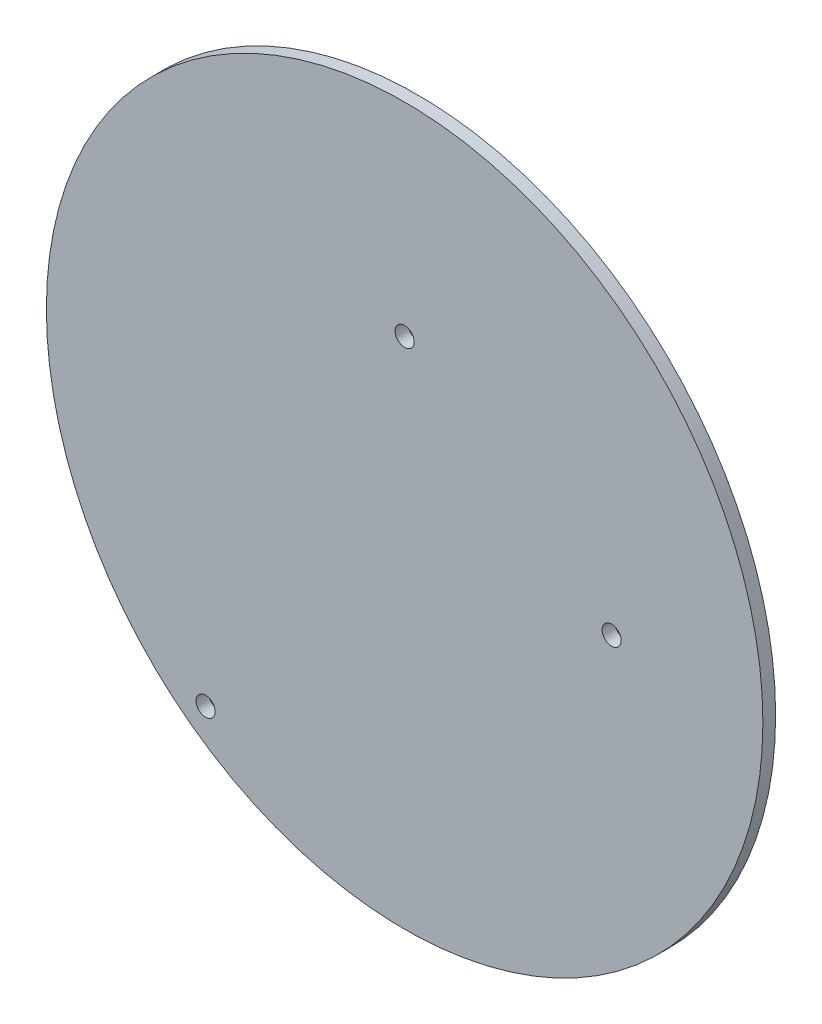
ISO-10303-21;
HEADER;
FILE_DESCRIPTION(('STEP AP214'),'2;1');
FILE_NAME('part.step','',(''),(''),'','','');
FILE_SCHEMA(('AUTOMOTIVE_DESIGN { 1 0 10303 214 1 1 1 1 }'));
ENDSEC;
DATA;
#1=APPLICATION_CONTEXT('core data for automotive mechanical design processes');
#2=APPLICATION_PROTOCOL_DEFINITION('international standard','automotive_design',2000,#1);
#3=PRODUCT_CONTEXT('',#1,'mechanical');
#4=PRODUCT('Part','Part','',(#3));
#5=PRODUCT_RELATED_PRODUCT_CATEGORY('part','',(#4));
#6=PRODUCT_DEFINITION_FORMATION('','',#4);
#7=PRODUCT_DEFINITION_CONTEXT('part definition',#1,'design');
#8=PRODUCT_DEFINITION('design','',#6,#7);
#9=PRODUCT_DEFINITION_SHAPE('','',#8);
#10=(LENGTH_UNIT() NAMED_UNIT(*) SI_UNIT(.MILLI.,.METRE.));
#11=(NAMED_UNIT(*) PLANE_ANGLE_UNIT() SI_UNIT($,.RADIAN.));
#12=(NAMED_UNIT(*) SI_UNIT($,.STERADIAN.) SOLID_ANGLE_UNIT());
#13=UNCERTAINTY_MEASURE_WITH_UNIT(LENGTH_MEASURE(1.E-05),#10,'distance_accuracy_value','');
#14=(GEOMETRIC_REPRESENTATION_CONTEXT(3) GLOBAL_UNCERTAINTY_ASSIGNED_CONTEXT((#13)) GLOBAL_UNIT_ASSIGNED_CONTEXT((#10,
#11,#12)) REPRESENTATION_CONTEXT('',''));
#15=CARTESIAN_POINT('',(0.,0.,0.));
#16=DIRECTION('',(0.,0.,1.));
#17=DIRECTION('',(1.,0.,0.));
#18=AXIS2_PLACEMENT_3D('',#15,#16,#17);
#19=CARTESIAN_POINT('',(0.,0.,1.6));
#20=DIRECTION('',(0.,0.,1.));
#21=DIRECTION('',(1.,0.,0.));
#22=AXIS2_PLACEMENT_3D('',#19,#20,#21);
#23=PLANE('',#22);
#24=CARTESIAN_POINT('',(0.,19.5,1.6));
#25=DIRECTION('',(0.,0.,1.));
#26=DIRECTION('',(1.,0.,0.));
#27=AXIS2_PLACEMENT_3D('',#24,#25,#26);
#28=CIRCLE('',#27,1.2);
#29=CARTESIAN_POINT('',(1.2,19.5,1.6));
#30=VERTEX_POINT('',#29);
#31=EDGE_CURVE('E61',#30,#30,#28,.F.);
#32=ORIENTED_EDGE('',*,*,#31,.T.);
#33=EDGE_LOOP('',(#32));
#34=FACE_BOUND('',#33,.T.);
#35=CARTESIAN_POINT('',(0.,0.,1.6));
#36=DIRECTION('',(0.,0.,1.));
#37=DIRECTION('',(1.,0.,0.));
#38=AXIS2_PLACEMENT_3D('',#35,#36,#37);
#39=CIRCLE('',#38,45.);
#40=CARTESIAN_POINT('',(45.,0.,1.6));
#41=VERTEX_POINT('',#40);
#42=EDGE_CURVE('E10',#41,#41,#39,.T.);
#43=ORIENTED_EDGE('',*,*,#42,.T.);
#44=EDGE_LOOP('',(#43));
#45=FACE_BOUND('',#44,.T.);
#46=CARTESIAN_POINT('',(-25.,-33.2214750669603,1.6));
#47=DIRECTION('',(0.,0.,1.));
#48=DIRECTION('',(1.,0.,0.));
#49=AXIS2_PLACEMENT_3D('',#46,#47,#48);
#50=CIRCLE('',#49,1.2);
#51=CARTESIAN_POINT('',(-23.8,-33.2214750669603,1.6));
#52=VERTEX_POINT('',#51);
#53=EDGE_CURVE('E54',#52,#52,#50,.F.);
#54=ORIENTED_EDGE('',*,*,#53,.T.);
#55=EDGE_LOOP('',(#54));
#56=FACE_BOUND('',#55,.T.);
#57=CARTESIAN_POINT('',(26.,0.,1.6));
#58=DIRECTION('',(0.,0.,1.));
#59=DIRECTION('',(1.,0.,0.));
#60=AXIS2_PLACEMENT_3D('',#57,#58,#59);
#61=CIRCLE('',#60,1.2);
#62=CARTESIAN_POINT('',(27.2,0.,1.6));
#63=VERTEX_POINT('',#62);
#64=EDGE_CURVE('E67',#63,#63,#61,.F.);
#65=ORIENTED_EDGE('',*,*,#64,.T.);
#66=EDGE_LOOP('',(#65));
#67=FACE_BOUND('',#66,.T.);
#68=ADVANCED_FACE('F43',(#34,#45,#56,#67),#23,.T.);
#69=CARTESIAN_POINT('',(0.,0.,1.6));
#70=DIRECTION('',(0.,0.,-1.));
#71=DIRECTION('',(-1.,0.,0.));
#72=AXIS2_PLACEMENT_3D('',#69,#70,#71);
#73=CYLINDRICAL_SURFACE('',#72,45.);
#74=ORIENTED_EDGE('',*,*,#42,.F.);
#75=EDGE_LOOP('',(#74));
#76=FACE_BOUND('',#75,.T.);
#77=CARTESIAN_POINT('',(0.,0.,0.));
#78=DIRECTION('',(0.,0.,1.));
#79=DIRECTION('',(1.,0.,0.));
#80=AXIS2_PLACEMENT_3D('',#77,#78,#79);
#81=CIRCLE('',#80,45.);
#82=CARTESIAN_POINT('',(45.,0.,0.));
#83=VERTEX_POINT('',#82);
#84=EDGE_CURVE('E47',#83,#83,#81,.T.);
#85=ORIENTED_EDGE('',*,*,#84,.T.);
#86=EDGE_LOOP('',(#85));
#87=FACE_BOUND('',#86,.T.);
#88=ADVANCED_FACE('F45',(#76,#87),#73,.T.);
#89=CARTESIAN_POINT('',(0.,0.,0.));
#90=DIRECTION('',(0.,0.,1.));
#91=DIRECTION('',(1.,0.,0.));
#92=AXIS2_PLACEMENT_3D('',#89,#90,#91);
#93=PLANE('',#92);
#94=CARTESIAN_POINT('',(26.,0.,0.));
#95=DIRECTION('',(0.,0.,-1.));
#96=DIRECTION('',(-1.,0.,0.));
#97=AXIS2_PLACEMENT_3D('',#94,#95,#96);
#98=CIRCLE('',#97,1.2);
#99=CARTESIAN_POINT('',(24.8,0.,0.));
#100=VERTEX_POINT('',#99);
#101=EDGE_CURVE('E70',#100,#100,#98,.T.);
#102=ORIENTED_EDGE('',*,*,#101,.F.);
#103=EDGE_LOOP('',(#102));
#104=FACE_BOUND('',#103,.T.);
#105=CARTESIAN_POINT('',(0.,19.5,0.));
#106=DIRECTION('',(0.,0.,-1.));
#107=DIRECTION('',(-1.,0.,0.));
#108=AXIS2_PLACEMENT_3D('',#105,#106,#107);
#109=CIRCLE('',#108,1.2);
#110=CARTESIAN_POINT('',(-1.2,19.5,0.));
#111=VERTEX_POINT('',#110);
#112=EDGE_CURVE('E64',#111,#111,#109,.T.);
#113=ORIENTED_EDGE('',*,*,#112,.F.);
#114=EDGE_LOOP('',(#113));
#115=FACE_BOUND('',#114,.T.);
#116=CARTESIAN_POINT('',(-25.,-33.2214750669603,0.));
#117=DIRECTION('',(0.,0.,-1.));
#118=DIRECTION('',(-1.,0.,0.));
#119=AXIS2_PLACEMENT_3D('',#116,#117,#118);
#120=CIRCLE('',#119,1.2);
#121=CARTESIAN_POINT('',(-26.2,-33.2214750669603,0.));
#122=VERTEX_POINT('',#121);
#123=EDGE_CURVE('E58',#122,#122,#120,.T.);
#124=ORIENTED_EDGE('',*,*,#123,.F.);
#125=EDGE_LOOP('',(#124));
#126=FACE_BOUND('',#125,.T.);
#127=ORIENTED_EDGE('',*,*,#84,.F.);
#128=EDGE_LOOP('',(#127));
#129=FACE_BOUND('',#128,.T.);
#130=ADVANCED_FACE('F76',(#104,#115,#126,#129),#93,.F.);
#131=CARTESIAN_POINT('',(-25.,-33.2214750669603,0.));
#132=DIRECTION('',(0.,0.,-1.));
#133=DIRECTION('',(-1.,0.,0.));
#134=AXIS2_PLACEMENT_3D('',#131,#132,#133);
#135=CYLINDRICAL_SURFACE('',#134,1.2);
#136=ORIENTED_EDGE('',*,*,#53,.F.);
#137=EDGE_LOOP('',(#136));
#138=FACE_BOUND('',#137,.T.);
#139=ORIENTED_EDGE('',*,*,#123,.T.);
#140=EDGE_LOOP('',(#139));
#141=FACE_BOUND('',#140,.T.);
#142=ADVANCED_FACE('F79',(#138,#141),#135,.F.);
#143=CARTESIAN_POINT('',(0.,19.5,0.));
#144=DIRECTION('',(0.,0.,-1.));
#145=DIRECTION('',(-1.,0.,0.));
#146=AXIS2_PLACEMENT_3D('',#143,#144,#145);
#147=CYLINDRICAL_SURFACE('',#146,1.2);
#148=ORIENTED_EDGE('',*,*,#31,.F.);
#149=EDGE_LOOP('',(#148));
#150=FACE_BOUND('',#149,.T.);
#151=ORIENTED_EDGE('',*,*,#112,.T.);
#152=EDGE_LOOP('',(#151));
#153=FACE_BOUND('',#152,.T.);
#154=ADVANCED_FACE('F98',(#150,#153),#147,.F.);
#155=CARTESIAN_POINT('',(26.,0.,0.));
#156=DIRECTION('',(0.,0.,-1.));
#157=DIRECTION('',(-1.,0.,0.));
#158=AXIS2_PLACEMENT_3D('',#155,#156,#157);
#159=CYLINDRICAL_SURFACE('',#158,1.2);
#160=ORIENTED_EDGE('',*,*,#64,.F.);
#161=EDGE_LOOP('',(#160));
#162=FACE_BOUND('',#161,.T.);
#163=ORIENTED_EDGE('',*,*,#101,.T.);
#164=EDGE_LOOP('',(#163));
#165=FACE_BOUND('',#164,.T.);
#166=ADVANCED_FACE('F74',(#162,#165),#159,.F.);
#167=CLOSED_SHELL('',(#68,#88,#130,#142,#154,#166));
#168=MANIFOLD_SOLID_BREP('B2',#167);
#169=ADVANCED_BREP_SHAPE_REPRESENTATION('',(#18,#168),#14);
#170=SHAPE_DEFINITION_REPRESENTATION(#9,#169);
ENDSEC;
END-ISO-10303-21;
